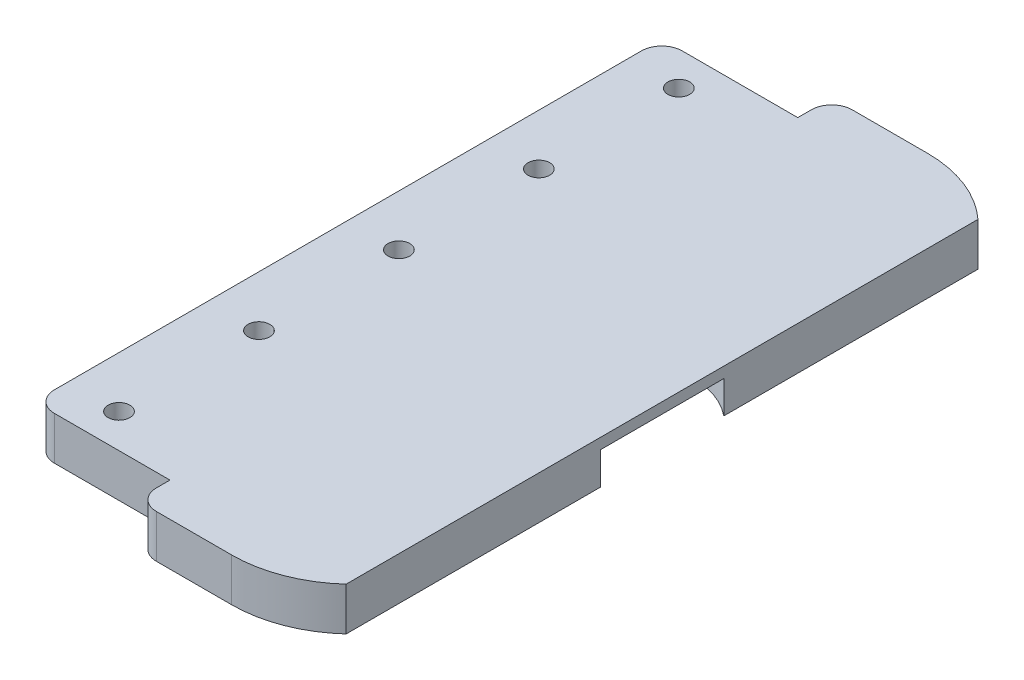
ISO-10303-21;
HEADER;
FILE_DESCRIPTION(('STEP AP214'),'2;1');
FILE_NAME('part.step','',(''),(''),'','','');
FILE_SCHEMA(('AUTOMOTIVE_DESIGN { 1 0 10303 214 1 1 1 1 }'));
ENDSEC;
DATA;
#1=APPLICATION_CONTEXT('core data for automotive mechanical design processes');
#2=APPLICATION_PROTOCOL_DEFINITION('international standard','automotive_design',2000,#1);
#3=PRODUCT_CONTEXT('',#1,'mechanical');
#4=PRODUCT('Part','Part','',(#3));
#5=PRODUCT_RELATED_PRODUCT_CATEGORY('part','',(#4));
#6=PRODUCT_DEFINITION_FORMATION('','',#4);
#7=PRODUCT_DEFINITION_CONTEXT('part definition',#1,'design');
#8=PRODUCT_DEFINITION('design','',#6,#7);
#9=PRODUCT_DEFINITION_SHAPE('','',#8);
#10=(LENGTH_UNIT() NAMED_UNIT(*) SI_UNIT(.MILLI.,.METRE.));
#11=(NAMED_UNIT(*) PLANE_ANGLE_UNIT() SI_UNIT($,.RADIAN.));
#12=(NAMED_UNIT(*) SI_UNIT($,.STERADIAN.) SOLID_ANGLE_UNIT());
#13=UNCERTAINTY_MEASURE_WITH_UNIT(LENGTH_MEASURE(1.E-05),#10,'distance_accuracy_value','');
#14=(GEOMETRIC_REPRESENTATION_CONTEXT(3) GLOBAL_UNCERTAINTY_ASSIGNED_CONTEXT((#13)) GLOBAL_UNIT_ASSIGNED_CONTEXT((#10,
#11,#12)) REPRESENTATION_CONTEXT('',''));
#15=CARTESIAN_POINT('',(0.,0.,0.));
#16=DIRECTION('',(0.,0.,1.));
#17=DIRECTION('',(1.,0.,0.));
#18=AXIS2_PLACEMENT_3D('',#15,#16,#17);
#19=CARTESIAN_POINT('',(38.876,37.2383188757529,-51.18));
#20=DIRECTION('',(0.,-1.,0.));
#21=DIRECTION('',(0.,0.,-1.));
#22=AXIS2_PLACEMENT_3D('',#19,#20,#21);
#23=CYLINDRICAL_SURFACE('',#22,11.684);
#24=DIRECTION('',(0.,-1.,0.));
#25=VECTOR('',#24,1.);
#26=CARTESIAN_POINT('',(46.2193008783632,37.2383188757529,-60.2680024323186));
#27=LINE('',#26,#25);
#28=CARTESIAN_POINT('',(46.2193008783632,4.7625,-60.2680024323186));
#29=VERTEX_POINT('',#28);
#30=CARTESIAN_POINT('',(46.2193008783632,0.,-60.2680024323186));
#31=VERTEX_POINT('',#30);
#32=EDGE_CURVE('E342',#29,#31,#27,.T.);
#33=ORIENTED_EDGE('',*,*,#32,.F.);
#34=CARTESIAN_POINT('',(38.876,4.7625,-51.18));
#35=DIRECTION('',(0.,-1.,0.));
#36=DIRECTION('',(0.,0.,-1.));
#37=AXIS2_PLACEMENT_3D('',#34,#35,#36);
#38=CIRCLE('',#37,11.684);
#39=CARTESIAN_POINT('',(30.3603757715597,4.7625,-59.18));
#40=VERTEX_POINT('',#39);
#41=EDGE_CURVE('E294',#40,#29,#38,.T.);
#42=ORIENTED_EDGE('',*,*,#41,.F.);
#43=DIRECTION('',(0.,-1.,0.));
#44=VECTOR('',#43,1.);
#45=CARTESIAN_POINT('',(30.3603757715597,37.2383188757529,-59.18));
#46=LINE('',#45,#44);
#47=CARTESIAN_POINT('',(30.3603757715597,0.,-59.18));
#48=VERTEX_POINT('',#47);
#49=EDGE_CURVE('E301',#40,#48,#46,.T.);
#50=ORIENTED_EDGE('',*,*,#49,.T.);
#51=CARTESIAN_POINT('',(38.876,0.,-51.18));
#52=DIRECTION('',(0.,1.,0.));
#53=DIRECTION('',(0.,0.,1.));
#54=AXIS2_PLACEMENT_3D('',#51,#52,#53);
#55=CIRCLE('',#54,11.684);
#56=EDGE_CURVE('E307',#31,#48,#55,.T.);
#57=ORIENTED_EDGE('',*,*,#56,.F.);
#58=EDGE_LOOP('',(#33,#42,#50,#57));
#59=FACE_BOUND('',#58,.T.);
#60=ADVANCED_FACE('F42',(#59),#23,.F.);
#61=CARTESIAN_POINT('',(0.,0.,0.));
#62=DIRECTION('',(0.,-1.,0.));
#63=DIRECTION('',(0.,0.,-1.));
#64=AXIS2_PLACEMENT_3D('',#61,#62,#63);
#65=PLANE('',#64);
#66=DIRECTION('',(0.,0.,-1.));
#67=VECTOR('',#66,1.);
#68=CARTESIAN_POINT('',(46.2193008783632,0.,-4.70584818081287));
#69=LINE('',#68,#67);
#70=CARTESIAN_POINT('',(46.2193008783632,0.,-4.70584818081287));
#71=VERTEX_POINT('',#70);
#72=CARTESIAN_POINT('',(46.2193008783632,0.,-42.0919975676814));
#73=VERTEX_POINT('',#72);
#74=EDGE_CURVE('E183',#71,#73,#69,.T.);
#75=ORIENTED_EDGE('',*,*,#74,.F.);
#76=CARTESIAN_POINT('',(34.084,0.,-18.));
#77=DIRECTION('',(0.,-1.,0.));
#78=DIRECTION('',(0.,0.,-1.));
#79=AXIS2_PLACEMENT_3D('',#76,#77,#78);
#80=CIRCLE('',#79,18.);
#81=CARTESIAN_POINT('',(34.084,0.,0.));
#82=VERTEX_POINT('',#81);
#83=EDGE_CURVE('E193',#71,#82,#80,.T.);
#84=ORIENTED_EDGE('',*,*,#83,.T.);
#85=DIRECTION('',(1.,0.,0.));
#86=VECTOR('',#85,1.);
#87=CARTESIAN_POINT('',(0.,0.,0.));
#88=LINE('',#87,#86);
#89=CARTESIAN_POINT('',(23.,0.,0.));
#90=VERTEX_POINT('',#89);
#91=EDGE_CURVE('E234',#90,#82,#88,.T.);
#92=ORIENTED_EDGE('',*,*,#91,.F.);
#93=CARTESIAN_POINT('',(23.,0.,-3.));
#94=DIRECTION('',(0.,-1.,0.));
#95=DIRECTION('',(0.,0.,-1.));
#96=AXIS2_PLACEMENT_3D('',#93,#94,#95);
#97=CIRCLE('',#96,3.);
#98=CARTESIAN_POINT('',(20.,0.,-3.));
#99=VERTEX_POINT('',#98);
#100=EDGE_CURVE('E201',#90,#99,#97,.T.);
#101=ORIENTED_EDGE('',*,*,#100,.T.);
#102=DIRECTION('',(0.,0.,-1.));
#103=VECTOR('',#102,1.);
#104=CARTESIAN_POINT('',(20.,0.,0.));
#105=LINE('',#104,#103);
#106=CARTESIAN_POINT('',(20.,0.,-5.));
#107=VERTEX_POINT('',#106);
#108=EDGE_CURVE('E346',#99,#107,#105,.T.);
#109=ORIENTED_EDGE('',*,*,#108,.T.);
#110=DIRECTION('',(-1.,0.,0.));
#111=VECTOR('',#110,1.);
#112=CARTESIAN_POINT('',(20.,0.,-5.));
#113=LINE('',#112,#111);
#114=CARTESIAN_POINT('',(3.,0.,-5.));
#115=VERTEX_POINT('',#114);
#116=EDGE_CURVE('E337',#107,#115,#113,.T.);
#117=ORIENTED_EDGE('',*,*,#116,.T.);
#118=CARTESIAN_POINT('',(3.,0.,-8.));
#119=DIRECTION('',(0.,-1.,0.));
#120=DIRECTION('',(0.,0.,-1.));
#121=AXIS2_PLACEMENT_3D('',#118,#119,#120);
#122=CIRCLE('',#121,3.);
#123=CARTESIAN_POINT('',(0.,0.,-8.));
#124=VERTEX_POINT('',#123);
#125=EDGE_CURVE('E203',#115,#124,#122,.T.);
#126=ORIENTED_EDGE('',*,*,#125,.T.);
#127=DIRECTION('',(0.,0.,-1.));
#128=VECTOR('',#127,1.);
#129=CARTESIAN_POINT('',(0.,0.,0.));
#130=LINE('',#129,#128);
#131=CARTESIAN_POINT('',(0.,0.,-94.362));
#132=VERTEX_POINT('',#131);
#133=EDGE_CURVE('E251',#124,#132,#130,.T.);
#134=ORIENTED_EDGE('',*,*,#133,.T.);
#135=CARTESIAN_POINT('',(3.,0.,-94.362));
#136=DIRECTION('',(0.,-1.,0.));
#137=DIRECTION('',(0.,0.,-1.));
#138=AXIS2_PLACEMENT_3D('',#135,#136,#137);
#139=CIRCLE('',#138,3.);
#140=CARTESIAN_POINT('',(3.,0.,-97.362));
#141=VERTEX_POINT('',#140);
#142=EDGE_CURVE('E205',#132,#141,#139,.T.);
#143=ORIENTED_EDGE('',*,*,#142,.T.);
#144=DIRECTION('',(1.,0.,0.));
#145=VECTOR('',#144,1.);
#146=CARTESIAN_POINT('',(0.,0.,-97.362));
#147=LINE('',#146,#145);
#148=CARTESIAN_POINT('',(20.,0.,-97.362));
#149=VERTEX_POINT('',#148);
#150=EDGE_CURVE('E335',#141,#149,#147,.T.);
#151=ORIENTED_EDGE('',*,*,#150,.T.);
#152=DIRECTION('',(0.,0.,1.));
#153=VECTOR('',#152,1.);
#154=CARTESIAN_POINT('',(20.,0.,-102.362));
#155=LINE('',#154,#153);
#156=CARTESIAN_POINT('',(20.,0.,-99.362));
#157=VERTEX_POINT('',#156);
#158=EDGE_CURVE('E330',#157,#149,#155,.T.);
#159=ORIENTED_EDGE('',*,*,#158,.F.);
#160=CARTESIAN_POINT('',(23.,0.,-99.362));
#161=DIRECTION('',(0.,-1.,0.));
#162=DIRECTION('',(0.,0.,-1.));
#163=AXIS2_PLACEMENT_3D('',#160,#161,#162);
#164=CIRCLE('',#163,3.);
#165=CARTESIAN_POINT('',(23.,0.,-102.362));
#166=VERTEX_POINT('',#165);
#167=EDGE_CURVE('E207',#157,#166,#164,.T.);
#168=ORIENTED_EDGE('',*,*,#167,.T.);
#169=DIRECTION('',(1.,0.,0.));
#170=VECTOR('',#169,1.);
#171=CARTESIAN_POINT('',(0.,0.,-102.362));
#172=LINE('',#171,#170);
#173=CARTESIAN_POINT('',(34.084,0.,-102.362));
#174=VERTEX_POINT('',#173);
#175=EDGE_CURVE('E246',#166,#174,#172,.T.);
#176=ORIENTED_EDGE('',*,*,#175,.T.);
#177=CARTESIAN_POINT('',(34.084,0.,-84.362));
#178=DIRECTION('',(0.,-1.,0.));
#179=DIRECTION('',(0.,0.,-1.));
#180=AXIS2_PLACEMENT_3D('',#177,#178,#179);
#181=CIRCLE('',#180,18.);
#182=CARTESIAN_POINT('',(46.2193008783632,0.,-97.6561518191871));
#183=VERTEX_POINT('',#182);
#184=EDGE_CURVE('E255',#174,#183,#181,.T.);
#185=ORIENTED_EDGE('',*,*,#184,.T.);
#186=EDGE_CURVE('E57',#31,#183,#69,.T.);
#187=ORIENTED_EDGE('',*,*,#186,.F.);
#188=ORIENTED_EDGE('',*,*,#56,.T.);
#189=DIRECTION('',(0.,0.,-1.));
#190=VECTOR('',#189,1.);
#191=CARTESIAN_POINT('',(30.3603757715597,0.,0.));
#192=LINE('',#191,#190);
#193=CARTESIAN_POINT('',(30.3603757715597,0.,-43.18));
#194=VERTEX_POINT('',#193);
#195=EDGE_CURVE('E308',#194,#48,#192,.T.);
#196=ORIENTED_EDGE('',*,*,#195,.F.);
#197=EDGE_CURVE('E304',#194,#73,#55,.T.);
#198=ORIENTED_EDGE('',*,*,#197,.T.);
#199=EDGE_LOOP('',(#75,#84,#92,#101,#109,#117,#126,#134,#143,#151,#159,#168,#176,#185,#187,#188,
#196,#198));
#200=FACE_BOUND('',#199,.T.);
#201=CARTESIAN_POINT('',(38.876,0.,-95.63));
#202=DIRECTION('',(0.,1.,0.));
#203=DIRECTION('',(0.,0.,1.));
#204=AXIS2_PLACEMENT_3D('',#201,#202,#203);
#205=CIRCLE('',#204,3.45);
#206=CARTESIAN_POINT('',(38.876,0.,-92.18));
#207=VERTEX_POINT('',#206);
#208=EDGE_CURVE('E311',#207,#207,#205,.T.);
#209=ORIENTED_EDGE('',*,*,#208,.T.);
#210=EDGE_LOOP('',(#209));
#211=FACE_BOUND('',#210,.T.);
#212=CARTESIAN_POINT('',(7.50000000000086,0.,-10.002));
#213=DIRECTION('',(0.,1.,0.));
#214=DIRECTION('',(0.,0.,1.));
#215=AXIS2_PLACEMENT_3D('',#212,#213,#214);
#216=CIRCLE('',#215,1.6);
#217=CARTESIAN_POINT('',(7.50000000000086,0.,-8.40200000000001));
#218=VERTEX_POINT('',#217);
#219=EDGE_CURVE('E273',#218,#218,#216,.T.);
#220=ORIENTED_EDGE('',*,*,#219,.T.);
#221=EDGE_LOOP('',(#220));
#222=FACE_BOUND('',#221,.T.);
#223=CARTESIAN_POINT('',(7.50000000000065,0.,-30.592));
#224=DIRECTION('',(0.,1.,0.));
#225=DIRECTION('',(0.,0.,1.));
#226=AXIS2_PLACEMENT_3D('',#223,#224,#225);
#227=CIRCLE('',#226,1.6);
#228=CARTESIAN_POINT('',(7.50000000000065,0.,-28.992));
#229=VERTEX_POINT('',#228);
#230=EDGE_CURVE('E280',#229,#229,#227,.T.);
#231=ORIENTED_EDGE('',*,*,#230,.T.);
#232=EDGE_LOOP('',(#231));
#233=FACE_BOUND('',#232,.T.);
#234=CARTESIAN_POINT('',(7.50000000000043,0.,-51.182));
#235=DIRECTION('',(0.,1.,0.));
#236=DIRECTION('',(0.,0.,1.));
#237=AXIS2_PLACEMENT_3D('',#234,#235,#236);
#238=CIRCLE('',#237,1.6);
#239=CARTESIAN_POINT('',(7.50000000000043,0.,-49.582));
#240=VERTEX_POINT('',#239);
#241=EDGE_CURVE('E286',#240,#240,#238,.T.);
#242=ORIENTED_EDGE('',*,*,#241,.T.);
#243=EDGE_LOOP('',(#242));
#244=FACE_BOUND('',#243,.T.);
#245=CARTESIAN_POINT('',(7.5,0.,-92.362));
#246=DIRECTION('',(0.,1.,0.));
#247=DIRECTION('',(0.,0.,1.));
#248=AXIS2_PLACEMENT_3D('',#245,#246,#247);
#249=CIRCLE('',#248,1.6);
#250=CARTESIAN_POINT('',(7.5,0.,-90.762));
#251=VERTEX_POINT('',#250);
#252=EDGE_CURVE('E267',#251,#251,#249,.T.);
#253=ORIENTED_EDGE('',*,*,#252,.T.);
#254=EDGE_LOOP('',(#253));
#255=FACE_BOUND('',#254,.T.);
#256=CARTESIAN_POINT('',(7.50000000000022,0.,-71.772));
#257=DIRECTION('',(0.,1.,0.));
#258=DIRECTION('',(0.,0.,1.));
#259=AXIS2_PLACEMENT_3D('',#256,#257,#258);
#260=CIRCLE('',#259,1.6);
#261=CARTESIAN_POINT('',(7.50000000000022,0.,-70.172));
#262=VERTEX_POINT('',#261);
#263=EDGE_CURVE('E262',#262,#262,#260,.T.);
#264=ORIENTED_EDGE('',*,*,#263,.T.);
#265=EDGE_LOOP('',(#264));
#266=FACE_BOUND('',#265,.T.);
#267=CARTESIAN_POINT('',(38.876,0.,-6.73));
#268=DIRECTION('',(0.,1.,0.));
#269=DIRECTION('',(0.,0.,1.));
#270=AXIS2_PLACEMENT_3D('',#267,#268,#269);
#271=CIRCLE('',#270,3.45);
#272=CARTESIAN_POINT('',(38.876,0.,-3.28));
#273=VERTEX_POINT('',#272);
#274=EDGE_CURVE('E314',#273,#273,#271,.T.);
#275=ORIENTED_EDGE('',*,*,#274,.T.);
#276=EDGE_LOOP('',(#275));
#277=FACE_BOUND('',#276,.T.);
#278=ADVANCED_FACE('F241',(#200,#211,#222,#233,#244,#255,#266,#277),#65,.T.);
#279=CARTESIAN_POINT('',(0.,6.35,0.));
#280=DIRECTION('',(-1.,0.,0.));
#281=DIRECTION('',(0.,0.,1.));
#282=AXIS2_PLACEMENT_3D('',#279,#280,#281);
#283=PLANE('',#282);
#284=DIRECTION('',(0.,0.,-1.));
#285=VECTOR('',#284,1.);
#286=CARTESIAN_POINT('',(0.,6.35,0.));
#287=LINE('',#286,#285);
#288=CARTESIAN_POINT('',(0.,6.35,-8.));
#289=VERTEX_POINT('',#288);
#290=CARTESIAN_POINT('',(0.,6.35,-94.362));
#291=VERTEX_POINT('',#290);
#292=EDGE_CURVE('E245',#289,#291,#287,.T.);
#293=ORIENTED_EDGE('',*,*,#292,.T.);
#294=DIRECTION('',(0.,-1.,0.));
#295=VECTOR('',#294,1.);
#296=CARTESIAN_POINT('',(0.,6.35,-94.362));
#297=LINE('',#296,#295);
#298=EDGE_CURVE('E220',#291,#132,#297,.T.);
#299=ORIENTED_EDGE('',*,*,#298,.T.);
#300=ORIENTED_EDGE('',*,*,#133,.F.);
#301=DIRECTION('',(0.,-1.,0.));
#302=VECTOR('',#301,1.);
#303=CARTESIAN_POINT('',(0.,6.35,-8.));
#304=LINE('',#303,#302);
#305=EDGE_CURVE('E218',#124,#289,#304,.F.);
#306=ORIENTED_EDGE('',*,*,#305,.T.);
#307=EDGE_LOOP('',(#293,#299,#300,#306));
#308=FACE_BOUND('',#307,.T.);
#309=ADVANCED_FACE('F381',(#308),#283,.T.);
#310=CARTESIAN_POINT('',(0.,6.35,0.));
#311=DIRECTION('',(0.,0.,-1.));
#312=DIRECTION('',(-1.,0.,0.));
#313=AXIS2_PLACEMENT_3D('',#310,#311,#312);
#314=PLANE('',#313);
#315=DIRECTION('',(1.,0.,0.));
#316=VECTOR('',#315,1.);
#317=CARTESIAN_POINT('',(0.,6.35,0.));
#318=LINE('',#317,#316);
#319=CARTESIAN_POINT('',(23.,6.35,0.));
#320=VERTEX_POINT('',#319);
#321=CARTESIAN_POINT('',(34.084,6.35,0.));
#322=VERTEX_POINT('',#321);
#323=EDGE_CURVE('E236',#320,#322,#318,.T.);
#324=ORIENTED_EDGE('',*,*,#323,.F.);
#325=DIRECTION('',(0.,-1.,0.));
#326=VECTOR('',#325,1.);
#327=CARTESIAN_POINT('',(23.,0.,0.));
#328=LINE('',#327,#326);
#329=EDGE_CURVE('E50',#320,#90,#328,.T.);
#330=ORIENTED_EDGE('',*,*,#329,.T.);
#331=ORIENTED_EDGE('',*,*,#91,.T.);
#332=DIRECTION('',(0.,-1.,0.));
#333=VECTOR('',#332,1.);
#334=CARTESIAN_POINT('',(34.084,6.35,0.));
#335=LINE('',#334,#333);
#336=EDGE_CURVE('E189',#82,#322,#335,.F.);
#337=ORIENTED_EDGE('',*,*,#336,.T.);
#338=EDGE_LOOP('',(#324,#330,#331,#337));
#339=FACE_BOUND('',#338,.T.);
#340=ADVANCED_FACE('F233',(#339),#314,.F.);
#341=CARTESIAN_POINT('',(0.,6.35,0.));
#342=DIRECTION('',(0.,-1.,0.));
#343=DIRECTION('',(0.,0.,-1.));
#344=AXIS2_PLACEMENT_3D('',#341,#342,#343);
#345=PLANE('',#344);
#346=CARTESIAN_POINT('',(7.50000000000086,6.35,-10.002));
#347=DIRECTION('',(0.,1.,0.));
#348=DIRECTION('',(0.,0.,1.));
#349=AXIS2_PLACEMENT_3D('',#346,#347,#348);
#350=CIRCLE('',#349,1.6);
#351=CARTESIAN_POINT('',(7.50000000000086,6.35,-8.40200000000001));
#352=VERTEX_POINT('',#351);
#353=EDGE_CURVE('E270',#352,#352,#350,.T.);
#354=ORIENTED_EDGE('',*,*,#353,.F.);
#355=EDGE_LOOP('',(#354));
#356=FACE_BOUND('',#355,.T.);
#357=CARTESIAN_POINT('',(7.50000000000065,6.35,-30.592));
#358=DIRECTION('',(0.,1.,0.));
#359=DIRECTION('',(0.,0.,1.));
#360=AXIS2_PLACEMENT_3D('',#357,#358,#359);
#361=CIRCLE('',#360,1.6);
#362=CARTESIAN_POINT('',(7.50000000000065,6.35,-28.992));
#363=VERTEX_POINT('',#362);
#364=EDGE_CURVE('E277',#363,#363,#361,.T.);
#365=ORIENTED_EDGE('',*,*,#364,.F.);
#366=EDGE_LOOP('',(#365));
#367=FACE_BOUND('',#366,.T.);
#368=CARTESIAN_POINT('',(7.50000000000043,6.35,-51.182));
#369=DIRECTION('',(0.,1.,0.));
#370=DIRECTION('',(0.,0.,1.));
#371=AXIS2_PLACEMENT_3D('',#368,#369,#370);
#372=CIRCLE('',#371,1.6);
#373=CARTESIAN_POINT('',(7.50000000000043,6.35,-49.582));
#374=VERTEX_POINT('',#373);
#375=EDGE_CURVE('E283',#374,#374,#372,.T.);
#376=ORIENTED_EDGE('',*,*,#375,.F.);
#377=EDGE_LOOP('',(#376));
#378=FACE_BOUND('',#377,.T.);
#379=CARTESIAN_POINT('',(7.5,6.35,-92.362));
#380=DIRECTION('',(0.,1.,0.));
#381=DIRECTION('',(0.,0.,1.));
#382=AXIS2_PLACEMENT_3D('',#379,#380,#381);
#383=CIRCLE('',#382,1.6);
#384=CARTESIAN_POINT('',(7.5,6.35,-90.762));
#385=VERTEX_POINT('',#384);
#386=EDGE_CURVE('E289',#385,#385,#383,.T.);
#387=ORIENTED_EDGE('',*,*,#386,.F.);
#388=EDGE_LOOP('',(#387));
#389=FACE_BOUND('',#388,.T.);
#390=CARTESIAN_POINT('',(7.50000000000022,6.35,-71.772));
#391=DIRECTION('',(0.,1.,0.));
#392=DIRECTION('',(0.,0.,1.));
#393=AXIS2_PLACEMENT_3D('',#390,#391,#392);
#394=CIRCLE('',#393,1.6);
#395=CARTESIAN_POINT('',(7.50000000000022,6.35,-70.172));
#396=VERTEX_POINT('',#395);
#397=EDGE_CURVE('E259',#396,#396,#394,.T.);
#398=ORIENTED_EDGE('',*,*,#397,.F.);
#399=EDGE_LOOP('',(#398));
#400=FACE_BOUND('',#399,.T.);
#401=CARTESIAN_POINT('',(34.084,6.35,-18.));
#402=DIRECTION('',(0.,-1.,0.));
#403=DIRECTION('',(0.,0.,-1.));
#404=AXIS2_PLACEMENT_3D('',#401,#402,#403);
#405=CIRCLE('',#404,18.);
#406=CARTESIAN_POINT('',(46.2193008783632,6.35,-4.70584818081287));
#407=VERTEX_POINT('',#406);
#408=EDGE_CURVE('E182',#322,#407,#405,.F.);
#409=ORIENTED_EDGE('',*,*,#408,.T.);
#410=DIRECTION('',(0.,0.,-1.));
#411=VECTOR('',#410,1.);
#412=CARTESIAN_POINT('',(46.2193008783632,6.35,-4.70584818081287));
#413=LINE('',#412,#411);
#414=CARTESIAN_POINT('',(46.2193008783632,6.35,-97.6561518191871));
#415=VERTEX_POINT('',#414);
#416=EDGE_CURVE('E168',#407,#415,#413,.T.);
#417=ORIENTED_EDGE('',*,*,#416,.T.);
#418=CARTESIAN_POINT('',(34.084,6.35,-84.362));
#419=DIRECTION('',(0.,-1.,0.));
#420=DIRECTION('',(0.,0.,-1.));
#421=AXIS2_PLACEMENT_3D('',#418,#419,#420);
#422=CIRCLE('',#421,18.);
#423=CARTESIAN_POINT('',(34.084,6.35,-102.362));
#424=VERTEX_POINT('',#423);
#425=EDGE_CURVE('E179',#415,#424,#422,.F.);
#426=ORIENTED_EDGE('',*,*,#425,.T.);
#427=DIRECTION('',(1.,0.,0.));
#428=VECTOR('',#427,1.);
#429=CARTESIAN_POINT('',(0.,6.35,-102.362));
#430=LINE('',#429,#428);
#431=CARTESIAN_POINT('',(23.,6.35,-102.362));
#432=VERTEX_POINT('',#431);
#433=EDGE_CURVE('E249',#432,#424,#430,.T.);
#434=ORIENTED_EDGE('',*,*,#433,.F.);
#435=CARTESIAN_POINT('',(23.,6.35,-99.362));
#436=DIRECTION('',(0.,-1.,0.));
#437=DIRECTION('',(0.,0.,-1.));
#438=AXIS2_PLACEMENT_3D('',#435,#436,#437);
#439=CIRCLE('',#438,3.);
#440=CARTESIAN_POINT('',(20.,6.35,-99.362));
#441=VERTEX_POINT('',#440);
#442=EDGE_CURVE('E216',#432,#441,#439,.F.);
#443=ORIENTED_EDGE('',*,*,#442,.T.);
#444=DIRECTION('',(0.,0.,1.));
#445=VECTOR('',#444,1.);
#446=CARTESIAN_POINT('',(20.,6.35,-102.362));
#447=LINE('',#446,#445);
#448=CARTESIAN_POINT('',(20.,6.35,-97.362));
#449=VERTEX_POINT('',#448);
#450=EDGE_CURVE('E331',#441,#449,#447,.T.);
#451=ORIENTED_EDGE('',*,*,#450,.T.);
#452=DIRECTION('',(1.,0.,0.));
#453=VECTOR('',#452,1.);
#454=CARTESIAN_POINT('',(0.,6.35,-97.362));
#455=LINE('',#454,#453);
#456=CARTESIAN_POINT('',(3.,6.35,-97.362));
#457=VERTEX_POINT('',#456);
#458=EDGE_CURVE('E328',#457,#449,#455,.T.);
#459=ORIENTED_EDGE('',*,*,#458,.F.);
#460=CARTESIAN_POINT('',(3.,6.35,-94.362));
#461=DIRECTION('',(0.,-1.,0.));
#462=DIRECTION('',(0.,0.,-1.));
#463=AXIS2_PLACEMENT_3D('',#460,#461,#462);
#464=CIRCLE('',#463,3.);
#465=EDGE_CURVE('E214',#457,#291,#464,.F.);
#466=ORIENTED_EDGE('',*,*,#465,.T.);
#467=ORIENTED_EDGE('',*,*,#292,.F.);
#468=CARTESIAN_POINT('',(3.,6.35,-8.));
#469=DIRECTION('',(0.,-1.,0.));
#470=DIRECTION('',(0.,0.,-1.));
#471=AXIS2_PLACEMENT_3D('',#468,#469,#470);
#472=CIRCLE('',#471,3.);
#473=CARTESIAN_POINT('',(3.,6.35,-5.));
#474=VERTEX_POINT('',#473);
#475=EDGE_CURVE('E65',#289,#474,#472,.F.);
#476=ORIENTED_EDGE('',*,*,#475,.T.);
#477=DIRECTION('',(-1.,0.,0.));
#478=VECTOR('',#477,1.);
#479=CARTESIAN_POINT('',(20.,6.35,-5.));
#480=LINE('',#479,#478);
#481=CARTESIAN_POINT('',(20.,6.35,-5.));
#482=VERTEX_POINT('',#481);
#483=EDGE_CURVE('E348',#482,#474,#480,.T.);
#484=ORIENTED_EDGE('',*,*,#483,.F.);
#485=DIRECTION('',(0.,0.,-1.));
#486=VECTOR('',#485,1.);
#487=CARTESIAN_POINT('',(20.,6.35,0.));
#488=LINE('',#487,#486);
#489=CARTESIAN_POINT('',(20.,6.35,-3.));
#490=VERTEX_POINT('',#489);
#491=EDGE_CURVE('E345',#490,#482,#488,.T.);
#492=ORIENTED_EDGE('',*,*,#491,.F.);
#493=CARTESIAN_POINT('',(23.,6.35,-3.));
#494=DIRECTION('',(0.,-1.,0.));
#495=DIRECTION('',(0.,0.,-1.));
#496=AXIS2_PLACEMENT_3D('',#493,#494,#495);
#497=CIRCLE('',#496,3.);
#498=EDGE_CURVE('E211',#490,#320,#497,.F.);
#499=ORIENTED_EDGE('',*,*,#498,.T.);
#500=ORIENTED_EDGE('',*,*,#323,.T.);
#501=EDGE_LOOP('',(#409,#417,#426,#434,#443,#451,#459,#466,#467,#476,#484,#492,#499,#500));
#502=FACE_BOUND('',#501,.T.);
#503=ADVANCED_FACE('F177',(#356,#367,#378,#389,#400,#502),#345,.F.);
#504=CARTESIAN_POINT('',(0.,6.35,-102.362));
#505=DIRECTION('',(0.,0.,-1.));
#506=DIRECTION('',(-1.,0.,0.));
#507=AXIS2_PLACEMENT_3D('',#504,#505,#506);
#508=PLANE('',#507);
#509=ORIENTED_EDGE('',*,*,#175,.F.);
#510=DIRECTION('',(0.,-1.,0.));
#511=VECTOR('',#510,1.);
#512=CARTESIAN_POINT('',(23.,6.35,-102.362));
#513=LINE('',#512,#511);
#514=EDGE_CURVE('E209',#166,#432,#513,.F.);
#515=ORIENTED_EDGE('',*,*,#514,.T.);
#516=ORIENTED_EDGE('',*,*,#433,.T.);
#517=DIRECTION('',(0.,-1.,0.));
#518=VECTOR('',#517,1.);
#519=CARTESIAN_POINT('',(34.084,0.,-102.362));
#520=LINE('',#519,#518);
#521=EDGE_CURVE('E188',#424,#174,#520,.T.);
#522=ORIENTED_EDGE('',*,*,#521,.T.);
#523=EDGE_LOOP('',(#509,#515,#516,#522));
#524=FACE_BOUND('',#523,.T.);
#525=ADVANCED_FACE('F407',(#524),#508,.T.);
#526=CARTESIAN_POINT('',(7.50000000000022,6.35,-71.772));
#527=DIRECTION('',(0.,-1.,0.));
#528=DIRECTION('',(0.,0.,-1.));
#529=AXIS2_PLACEMENT_3D('',#526,#527,#528);
#530=CYLINDRICAL_SURFACE('',#529,1.6);
#531=ORIENTED_EDGE('',*,*,#397,.T.);
#532=EDGE_LOOP('',(#531));
#533=FACE_BOUND('',#532,.T.);
#534=ORIENTED_EDGE('',*,*,#263,.F.);
#535=EDGE_LOOP('',(#534));
#536=FACE_BOUND('',#535,.T.);
#537=ADVANCED_FACE('F403',(#533,#536),#530,.F.);
#538=CARTESIAN_POINT('',(7.5,6.35,-92.362));
#539=DIRECTION('',(0.,-1.,0.));
#540=DIRECTION('',(0.,0.,-1.));
#541=AXIS2_PLACEMENT_3D('',#538,#539,#540);
#542=CYLINDRICAL_SURFACE('',#541,1.6);
#543=ORIENTED_EDGE('',*,*,#386,.T.);
#544=EDGE_LOOP('',(#543));
#545=FACE_BOUND('',#544,.T.);
#546=ORIENTED_EDGE('',*,*,#252,.F.);
#547=EDGE_LOOP('',(#546));
#548=FACE_BOUND('',#547,.T.);
#549=ADVANCED_FACE('F406',(#545,#548),#542,.F.);
#550=CARTESIAN_POINT('',(7.50000000000043,6.35,-51.182));
#551=DIRECTION('',(0.,-1.,0.));
#552=DIRECTION('',(0.,0.,-1.));
#553=AXIS2_PLACEMENT_3D('',#550,#551,#552);
#554=CYLINDRICAL_SURFACE('',#553,1.6);
#555=ORIENTED_EDGE('',*,*,#375,.T.);
#556=EDGE_LOOP('',(#555));
#557=FACE_BOUND('',#556,.T.);
#558=ORIENTED_EDGE('',*,*,#241,.F.);
#559=EDGE_LOOP('',(#558));
#560=FACE_BOUND('',#559,.T.);
#561=ADVANCED_FACE('F397',(#557,#560),#554,.F.);
#562=CARTESIAN_POINT('',(7.50000000000065,6.35,-30.592));
#563=DIRECTION('',(0.,-1.,0.));
#564=DIRECTION('',(0.,0.,-1.));
#565=AXIS2_PLACEMENT_3D('',#562,#563,#564);
#566=CYLINDRICAL_SURFACE('',#565,1.6);
#567=ORIENTED_EDGE('',*,*,#364,.T.);
#568=EDGE_LOOP('',(#567));
#569=FACE_BOUND('',#568,.T.);
#570=ORIENTED_EDGE('',*,*,#230,.F.);
#571=EDGE_LOOP('',(#570));
#572=FACE_BOUND('',#571,.T.);
#573=ADVANCED_FACE('F392',(#569,#572),#566,.F.);
#574=CARTESIAN_POINT('',(7.50000000000086,6.35,-10.002));
#575=DIRECTION('',(0.,-1.,0.));
#576=DIRECTION('',(0.,0.,-1.));
#577=AXIS2_PLACEMENT_3D('',#574,#575,#576);
#578=CYLINDRICAL_SURFACE('',#577,1.6);
#579=ORIENTED_EDGE('',*,*,#353,.T.);
#580=EDGE_LOOP('',(#579));
#581=FACE_BOUND('',#580,.T.);
#582=ORIENTED_EDGE('',*,*,#219,.F.);
#583=EDGE_LOOP('',(#582));
#584=FACE_BOUND('',#583,.T.);
#585=ADVANCED_FACE('F386',(#581,#584),#578,.F.);
#586=DIRECTION('',(0.,-1.,0.));
#587=VECTOR('',#586,1.);
#588=CARTESIAN_POINT('',(46.2193008783632,37.2383188757529,-42.0919975676814));
#589=LINE('',#588,#587);
#590=CARTESIAN_POINT('',(46.2193008783632,4.7625,-42.0919975676814));
#591=VERTEX_POINT('',#590);
#592=EDGE_CURVE('E354',#73,#591,#589,.F.);
#593=ORIENTED_EDGE('',*,*,#592,.F.);
#594=ORIENTED_EDGE('',*,*,#197,.F.);
#595=DIRECTION('',(0.,-1.,0.));
#596=VECTOR('',#595,1.);
#597=CARTESIAN_POINT('',(30.3603757715597,37.2383188757529,-43.18));
#598=LINE('',#597,#596);
#599=CARTESIAN_POINT('',(30.3603757715597,4.7625,-43.18));
#600=VERTEX_POINT('',#599);
#601=EDGE_CURVE('E298',#600,#194,#598,.T.);
#602=ORIENTED_EDGE('',*,*,#601,.F.);
#603=EDGE_CURVE('E297',#591,#600,#38,.T.);
#604=ORIENTED_EDGE('',*,*,#603,.F.);
#605=EDGE_LOOP('',(#593,#594,#602,#604));
#606=FACE_BOUND('',#605,.T.);
#607=ADVANCED_FACE('F364',(#606),#23,.F.);
#608=CARTESIAN_POINT('',(30.3603757715597,37.2383188757529,0.));
#609=DIRECTION('',(-1.,0.,0.));
#610=DIRECTION('',(0.,0.,1.));
#611=AXIS2_PLACEMENT_3D('',#608,#609,#610);
#612=PLANE('',#611);
#613=DIRECTION('',(0.,0.,1.));
#614=VECTOR('',#613,1.);
#615=CARTESIAN_POINT('',(30.3603757715597,4.7625,0.));
#616=LINE('',#615,#614);
#617=EDGE_CURVE('E274',#40,#600,#616,.T.);
#618=ORIENTED_EDGE('',*,*,#617,.T.);
#619=ORIENTED_EDGE('',*,*,#601,.T.);
#620=ORIENTED_EDGE('',*,*,#195,.T.);
#621=ORIENTED_EDGE('',*,*,#49,.F.);
#622=EDGE_LOOP('',(#618,#619,#620,#621));
#623=FACE_BOUND('',#622,.T.);
#624=ADVANCED_FACE('F370',(#623),#612,.F.);
#625=CARTESIAN_POINT('',(0.,4.7625,0.));
#626=DIRECTION('',(0.,-1.,0.));
#627=DIRECTION('',(0.,0.,-1.));
#628=AXIS2_PLACEMENT_3D('',#625,#626,#627);
#629=PLANE('',#628);
#630=DIRECTION('',(0.,0.,-1.));
#631=VECTOR('',#630,1.);
#632=CARTESIAN_POINT('',(46.2193008783632,4.7625,0.));
#633=LINE('',#632,#631);
#634=EDGE_CURVE('E356',#591,#29,#633,.T.);
#635=ORIENTED_EDGE('',*,*,#634,.F.);
#636=ORIENTED_EDGE('',*,*,#603,.T.);
#637=ORIENTED_EDGE('',*,*,#617,.F.);
#638=ORIENTED_EDGE('',*,*,#41,.T.);
#639=EDGE_LOOP('',(#635,#636,#637,#638));
#640=FACE_BOUND('',#639,.T.);
#641=ADVANCED_FACE('F373',(#640),#629,.T.);
#642=CARTESIAN_POINT('',(38.876,37.2383188757529,-95.63));
#643=DIRECTION('',(0.,-1.,0.));
#644=DIRECTION('',(0.,0.,-1.));
#645=AXIS2_PLACEMENT_3D('',#642,#643,#644);
#646=CYLINDRICAL_SURFACE('',#645,3.45);
#647=CARTESIAN_POINT('',(38.876,4.7625,-95.63));
#648=DIRECTION('',(0.,-1.,0.));
#649=DIRECTION('',(0.,0.,-1.));
#650=AXIS2_PLACEMENT_3D('',#647,#648,#649);
#651=CIRCLE('',#650,3.45);
#652=CARTESIAN_POINT('',(38.876,4.7625,-99.08));
#653=VERTEX_POINT('',#652);
#654=EDGE_CURVE('E318',#653,#653,#651,.T.);
#655=ORIENTED_EDGE('',*,*,#654,.F.);
#656=EDGE_LOOP('',(#655));
#657=FACE_BOUND('',#656,.T.);
#658=ORIENTED_EDGE('',*,*,#208,.F.);
#659=EDGE_LOOP('',(#658));
#660=FACE_BOUND('',#659,.T.);
#661=ADVANCED_FACE('F465',(#657,#660),#646,.F.);
#662=CARTESIAN_POINT('',(0.,4.7625,0.));
#663=DIRECTION('',(0.,-1.,0.));
#664=DIRECTION('',(0.,0.,-1.));
#665=AXIS2_PLACEMENT_3D('',#662,#663,#664);
#666=PLANE('',#665);
#667=ORIENTED_EDGE('',*,*,#654,.T.);
#668=EDGE_LOOP('',(#667));
#669=FACE_BOUND('',#668,.T.);
#670=ADVANCED_FACE('F468',(#669),#666,.T.);
#671=CARTESIAN_POINT('',(38.876,37.2383188757529,-6.73));
#672=DIRECTION('',(0.,-1.,0.));
#673=DIRECTION('',(0.,0.,-1.));
#674=AXIS2_PLACEMENT_3D('',#671,#672,#673);
#675=CYLINDRICAL_SURFACE('',#674,3.45);
#676=CARTESIAN_POINT('',(38.876,4.7625,-6.73));
#677=DIRECTION('',(0.,-1.,0.));
#678=DIRECTION('',(0.,0.,-1.));
#679=AXIS2_PLACEMENT_3D('',#676,#677,#678);
#680=CIRCLE('',#679,3.45);
#681=CARTESIAN_POINT('',(38.876,4.7625,-10.18));
#682=VERTEX_POINT('',#681);
#683=EDGE_CURVE('E319',#682,#682,#680,.T.);
#684=ORIENTED_EDGE('',*,*,#683,.F.);
#685=EDGE_LOOP('',(#684));
#686=FACE_BOUND('',#685,.T.);
#687=ORIENTED_EDGE('',*,*,#274,.F.);
#688=EDGE_LOOP('',(#687));
#689=FACE_BOUND('',#688,.T.);
#690=ADVANCED_FACE('F472',(#686,#689),#675,.F.);
#691=CARTESIAN_POINT('',(0.,4.7625,0.));
#692=DIRECTION('',(0.,-1.,0.));
#693=DIRECTION('',(0.,0.,-1.));
#694=AXIS2_PLACEMENT_3D('',#691,#692,#693);
#695=PLANE('',#694);
#696=ORIENTED_EDGE('',*,*,#683,.T.);
#697=EDGE_LOOP('',(#696));
#698=FACE_BOUND('',#697,.T.);
#699=ADVANCED_FACE('F422',(#698),#695,.T.);
#700=CARTESIAN_POINT('',(34.084,6.35,-18.));
#701=DIRECTION('',(0.,-1.,0.));
#702=DIRECTION('',(0.,0.,-1.));
#703=AXIS2_PLACEMENT_3D('',#700,#701,#702);
#704=CYLINDRICAL_SURFACE('',#703,18.);
#705=DIRECTION('',(0.,-1.,0.));
#706=VECTOR('',#705,1.);
#707=CARTESIAN_POINT('',(46.2193008783632,6.35,-4.70584818081287));
#708=LINE('',#707,#706);
#709=EDGE_CURVE('E174',#407,#71,#708,.T.);
#710=ORIENTED_EDGE('',*,*,#709,.F.);
#711=ORIENTED_EDGE('',*,*,#408,.F.);
#712=ORIENTED_EDGE('',*,*,#336,.F.);
#713=ORIENTED_EDGE('',*,*,#83,.F.);
#714=EDGE_LOOP('',(#710,#711,#712,#713));
#715=FACE_BOUND('',#714,.T.);
#716=ADVANCED_FACE('F419',(#715),#704,.T.);
#717=CARTESIAN_POINT('',(34.084,6.35,-84.362));
#718=DIRECTION('',(0.,1.,0.));
#719=DIRECTION('',(0.,0.,1.));
#720=AXIS2_PLACEMENT_3D('',#717,#718,#719);
#721=CYLINDRICAL_SURFACE('',#720,18.);
#722=DIRECTION('',(0.,-1.,0.));
#723=VECTOR('',#722,1.);
#724=CARTESIAN_POINT('',(46.2193008783632,6.35,-97.6561518191871));
#725=LINE('',#724,#723);
#726=EDGE_CURVE('E165',#415,#183,#725,.T.);
#727=ORIENTED_EDGE('',*,*,#726,.T.);
#728=ORIENTED_EDGE('',*,*,#184,.F.);
#729=ORIENTED_EDGE('',*,*,#521,.F.);
#730=ORIENTED_EDGE('',*,*,#425,.F.);
#731=EDGE_LOOP('',(#727,#728,#729,#730));
#732=FACE_BOUND('',#731,.T.);
#733=ADVANCED_FACE('F186',(#732),#721,.T.);
#734=CARTESIAN_POINT('',(0.,6.35,-97.362));
#735=DIRECTION('',(0.,0.,-1.));
#736=DIRECTION('',(-1.,0.,0.));
#737=AXIS2_PLACEMENT_3D('',#734,#735,#736);
#738=PLANE('',#737);
#739=ORIENTED_EDGE('',*,*,#150,.F.);
#740=DIRECTION('',(0.,-1.,0.));
#741=VECTOR('',#740,1.);
#742=CARTESIAN_POINT('',(3.,6.35,-97.362));
#743=LINE('',#742,#741);
#744=EDGE_CURVE('E223',#141,#457,#743,.F.);
#745=ORIENTED_EDGE('',*,*,#744,.T.);
#746=ORIENTED_EDGE('',*,*,#458,.T.);
#747=DIRECTION('',(0.,-1.,0.));
#748=VECTOR('',#747,1.);
#749=CARTESIAN_POINT('',(20.,6.35,-97.362));
#750=LINE('',#749,#748);
#751=EDGE_CURVE('E334',#449,#149,#750,.T.);
#752=ORIENTED_EDGE('',*,*,#751,.T.);
#753=EDGE_LOOP('',(#739,#745,#746,#752));
#754=FACE_BOUND('',#753,.T.);
#755=ADVANCED_FACE('F426',(#754),#738,.T.);
#756=CARTESIAN_POINT('',(20.,6.35,-102.362));
#757=DIRECTION('',(1.,0.,0.));
#758=DIRECTION('',(0.,0.,-1.));
#759=AXIS2_PLACEMENT_3D('',#756,#757,#758);
#760=PLANE('',#759);
#761=ORIENTED_EDGE('',*,*,#450,.F.);
#762=DIRECTION('',(0.,-1.,0.));
#763=VECTOR('',#762,1.);
#764=CARTESIAN_POINT('',(20.,0.,-99.362));
#765=LINE('',#764,#763);
#766=EDGE_CURVE('E198',#441,#157,#765,.T.);
#767=ORIENTED_EDGE('',*,*,#766,.T.);
#768=ORIENTED_EDGE('',*,*,#158,.T.);
#769=ORIENTED_EDGE('',*,*,#751,.F.);
#770=EDGE_LOOP('',(#761,#767,#768,#769));
#771=FACE_BOUND('',#770,.T.);
#772=ADVANCED_FACE('F451',(#771),#760,.F.);
#773=CARTESIAN_POINT('',(20.,6.35,0.));
#774=DIRECTION('',(-1.,0.,0.));
#775=DIRECTION('',(0.,0.,1.));
#776=AXIS2_PLACEMENT_3D('',#773,#774,#775);
#777=PLANE('',#776);
#778=ORIENTED_EDGE('',*,*,#108,.F.);
#779=DIRECTION('',(0.,-1.,0.));
#780=VECTOR('',#779,1.);
#781=CARTESIAN_POINT('',(20.,6.35,-3.));
#782=LINE('',#781,#780);
#783=EDGE_CURVE('E12',#99,#490,#782,.F.);
#784=ORIENTED_EDGE('',*,*,#783,.T.);
#785=ORIENTED_EDGE('',*,*,#491,.T.);
#786=DIRECTION('',(0.,-1.,0.));
#787=VECTOR('',#786,1.);
#788=CARTESIAN_POINT('',(20.,6.35,-5.));
#789=LINE('',#788,#787);
#790=EDGE_CURVE('E322',#482,#107,#789,.T.);
#791=ORIENTED_EDGE('',*,*,#790,.T.);
#792=EDGE_LOOP('',(#778,#784,#785,#791));
#793=FACE_BOUND('',#792,.T.);
#794=ADVANCED_FACE('F448',(#793),#777,.T.);
#795=CARTESIAN_POINT('',(20.,6.35,-5.));
#796=DIRECTION('',(0.,0.,1.));
#797=DIRECTION('',(1.,0.,0.));
#798=AXIS2_PLACEMENT_3D('',#795,#796,#797);
#799=PLANE('',#798);
#800=ORIENTED_EDGE('',*,*,#483,.T.);
#801=DIRECTION('',(0.,-1.,0.));
#802=VECTOR('',#801,1.);
#803=CARTESIAN_POINT('',(3.,6.35,-5.));
#804=LINE('',#803,#802);
#805=EDGE_CURVE('E225',#474,#115,#804,.T.);
#806=ORIENTED_EDGE('',*,*,#805,.T.);
#807=ORIENTED_EDGE('',*,*,#116,.F.);
#808=ORIENTED_EDGE('',*,*,#790,.F.);
#809=EDGE_LOOP('',(#800,#806,#807,#808));
#810=FACE_BOUND('',#809,.T.);
#811=ADVANCED_FACE('F431',(#810),#799,.T.);
#812=CARTESIAN_POINT('',(23.,6.35,-99.362));
#813=DIRECTION('',(0.,1.,0.));
#814=DIRECTION('',(0.,0.,1.));
#815=AXIS2_PLACEMENT_3D('',#812,#813,#814);
#816=CYLINDRICAL_SURFACE('',#815,3.);
#817=ORIENTED_EDGE('',*,*,#442,.F.);
#818=ORIENTED_EDGE('',*,*,#514,.F.);
#819=ORIENTED_EDGE('',*,*,#167,.F.);
#820=ORIENTED_EDGE('',*,*,#766,.F.);
#821=EDGE_LOOP('',(#817,#818,#819,#820));
#822=FACE_BOUND('',#821,.T.);
#823=ADVANCED_FACE('F427',(#822),#816,.T.);
#824=CARTESIAN_POINT('',(3.,6.35,-94.362));
#825=DIRECTION('',(0.,-1.,0.));
#826=DIRECTION('',(0.,0.,-1.));
#827=AXIS2_PLACEMENT_3D('',#824,#825,#826);
#828=CYLINDRICAL_SURFACE('',#827,3.);
#829=ORIENTED_EDGE('',*,*,#465,.F.);
#830=ORIENTED_EDGE('',*,*,#744,.F.);
#831=ORIENTED_EDGE('',*,*,#142,.F.);
#832=ORIENTED_EDGE('',*,*,#298,.F.);
#833=EDGE_LOOP('',(#829,#830,#831,#832));
#834=FACE_BOUND('',#833,.T.);
#835=ADVANCED_FACE('F430',(#834),#828,.T.);
#836=CARTESIAN_POINT('',(3.,6.35,-8.));
#837=DIRECTION('',(0.,-1.,0.));
#838=DIRECTION('',(0.,0.,-1.));
#839=AXIS2_PLACEMENT_3D('',#836,#837,#838);
#840=CYLINDRICAL_SURFACE('',#839,3.);
#841=ORIENTED_EDGE('',*,*,#475,.F.);
#842=ORIENTED_EDGE('',*,*,#305,.F.);
#843=ORIENTED_EDGE('',*,*,#125,.F.);
#844=ORIENTED_EDGE('',*,*,#805,.F.);
#845=EDGE_LOOP('',(#841,#842,#843,#844));
#846=FACE_BOUND('',#845,.T.);
#847=ADVANCED_FACE('F434',(#846),#840,.T.);
#848=CARTESIAN_POINT('',(23.,6.35,-3.));
#849=DIRECTION('',(0.,1.,0.));
#850=DIRECTION('',(0.,0.,1.));
#851=AXIS2_PLACEMENT_3D('',#848,#849,#850);
#852=CYLINDRICAL_SURFACE('',#851,3.);
#853=ORIENTED_EDGE('',*,*,#498,.F.);
#854=ORIENTED_EDGE('',*,*,#783,.F.);
#855=ORIENTED_EDGE('',*,*,#100,.F.);
#856=ORIENTED_EDGE('',*,*,#329,.F.);
#857=EDGE_LOOP('',(#853,#854,#855,#856));
#858=FACE_BOUND('',#857,.T.);
#859=ADVANCED_FACE('F44',(#858),#852,.T.);
#860=CARTESIAN_POINT('',(46.2193008783632,6.35,-4.70584818081287));
#861=DIRECTION('',(-1.,0.,0.));
#862=DIRECTION('',(0.,0.,1.));
#863=AXIS2_PLACEMENT_3D('',#860,#861,#862);
#864=PLANE('',#863);
#865=ORIENTED_EDGE('',*,*,#32,.T.);
#866=ORIENTED_EDGE('',*,*,#186,.T.);
#867=ORIENTED_EDGE('',*,*,#726,.F.);
#868=ORIENTED_EDGE('',*,*,#416,.F.);
#869=ORIENTED_EDGE('',*,*,#709,.T.);
#870=ORIENTED_EDGE('',*,*,#74,.T.);
#871=ORIENTED_EDGE('',*,*,#592,.T.);
#872=ORIENTED_EDGE('',*,*,#634,.T.);
#873=EDGE_LOOP('',(#865,#866,#867,#868,#869,#870,#871,#872));
#874=FACE_BOUND('',#873,.T.);
#875=ADVANCED_FACE('F167',(#874),#864,.F.);
#876=CLOSED_SHELL('',(#60,#278,#309,#340,#503,#525,#537,#549,#561,#573,#585,#607,#624,#641,#661,
#670,#690,#699,#716,#733,#755,#772,#794,#811,#823,#835,#847,#859,#875));
#877=MANIFOLD_SOLID_BREP('B2',#876);
#878=ADVANCED_BREP_SHAPE_REPRESENTATION('',(#18,#877),#14);
#879=SHAPE_DEFINITION_REPRESENTATION(#9,#878);
ENDSEC;
END-ISO-10303-21;
